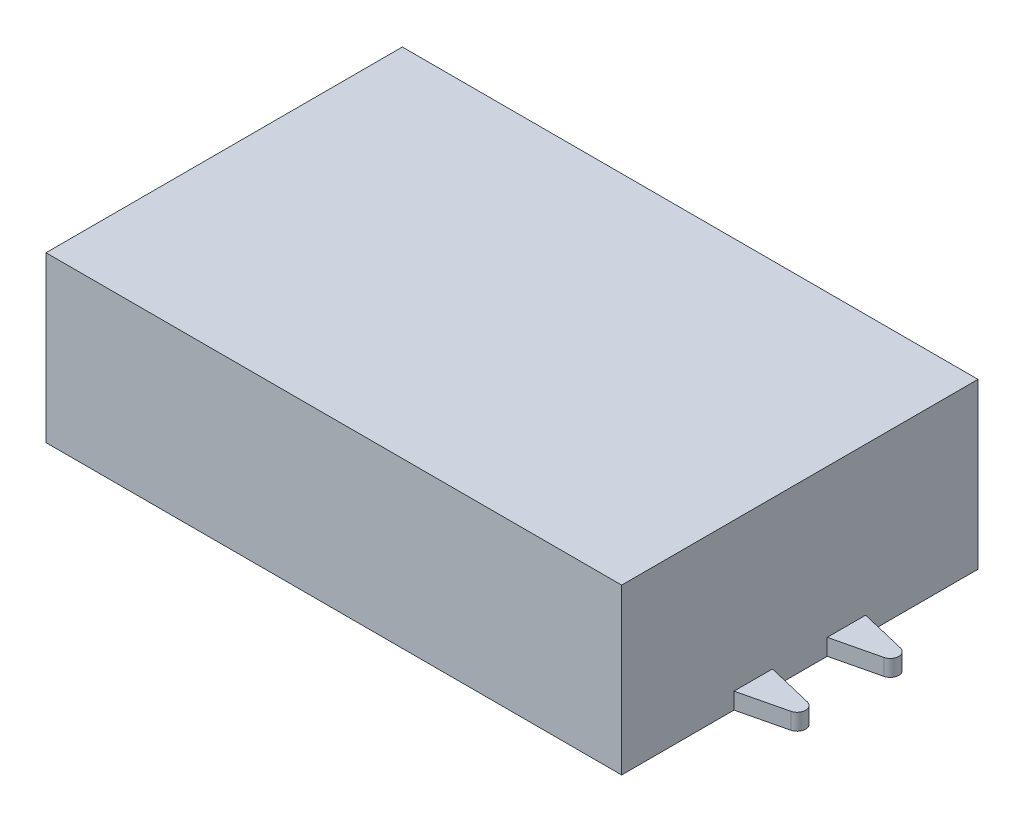
ISO-10303-21;
HEADER;
FILE_DESCRIPTION(('STEP AP214'),'2;1');
FILE_NAME('part.step','',(''),(''),'','','');
FILE_SCHEMA(('AUTOMOTIVE_DESIGN { 1 0 10303 214 1 1 1 1 }'));
ENDSEC;
DATA;
#1=APPLICATION_CONTEXT('core data for automotive mechanical design processes');
#2=APPLICATION_PROTOCOL_DEFINITION('international standard','automotive_design',2000,#1);
#3=PRODUCT_CONTEXT('',#1,'mechanical');
#4=PRODUCT('Part','Part','',(#3));
#5=PRODUCT_RELATED_PRODUCT_CATEGORY('part','',(#4));
#6=PRODUCT_DEFINITION_FORMATION('','',#4);
#7=PRODUCT_DEFINITION_CONTEXT('part definition',#1,'design');
#8=PRODUCT_DEFINITION('design','',#6,#7);
#9=PRODUCT_DEFINITION_SHAPE('','',#8);
#10=(LENGTH_UNIT() NAMED_UNIT(*) SI_UNIT(.MILLI.,.METRE.));
#11=(NAMED_UNIT(*) PLANE_ANGLE_UNIT() SI_UNIT($,.RADIAN.));
#12=(NAMED_UNIT(*) SI_UNIT($,.STERADIAN.) SOLID_ANGLE_UNIT());
#13=UNCERTAINTY_MEASURE_WITH_UNIT(LENGTH_MEASURE(1.E-05),#10,'distance_accuracy_value','');
#14=(GEOMETRIC_REPRESENTATION_CONTEXT(3) GLOBAL_UNCERTAINTY_ASSIGNED_CONTEXT((#13)) GLOBAL_UNIT_ASSIGNED_CONTEXT((#10,
#11,#12)) REPRESENTATION_CONTEXT('',''));
#15=CARTESIAN_POINT('',(0.,0.,0.));
#16=DIRECTION('',(0.,0.,1.));
#17=DIRECTION('',(1.,0.,0.));
#18=AXIS2_PLACEMENT_3D('',#15,#16,#17);
#19=CARTESIAN_POINT('',(-52.5,30.,32.5));
#20=DIRECTION('',(1.,0.,0.));
#21=DIRECTION('',(0.,0.,-1.));
#22=AXIS2_PLACEMENT_3D('',#19,#20,#21);
#23=PLANE('',#22);
#24=DIRECTION('',(0.,-1.,0.));
#25=VECTOR('',#24,1.);
#26=CARTESIAN_POINT('',(-52.5,3.,5.));
#27=LINE('',#26,#25);
#28=CARTESIAN_POINT('',(-52.5,3.,5.));
#29=VERTEX_POINT('',#28);
#30=CARTESIAN_POINT('',(-52.5,0.,5.));
#31=VERTEX_POINT('',#30);
#32=EDGE_CURVE('E53',#29,#31,#27,.T.);
#33=ORIENTED_EDGE('',*,*,#32,.F.);
#34=DIRECTION('',(0.,0.,-1.));
#35=VECTOR('',#34,1.);
#36=CARTESIAN_POINT('',(-52.5,3.,12.));
#37=LINE('',#36,#35);
#38=CARTESIAN_POINT('',(-52.5,3.,12.));
#39=VERTEX_POINT('',#38);
#40=EDGE_CURVE('E48',#39,#29,#37,.T.);
#41=ORIENTED_EDGE('',*,*,#40,.F.);
#42=DIRECTION('',(0.,-1.,0.));
#43=VECTOR('',#42,1.);
#44=CARTESIAN_POINT('',(-52.5,3.,12.));
#45=LINE('',#44,#43);
#46=CARTESIAN_POINT('',(-52.5,0.,12.));
#47=VERTEX_POINT('',#46);
#48=EDGE_CURVE('E189',#39,#47,#45,.T.);
#49=ORIENTED_EDGE('',*,*,#48,.T.);
#50=DIRECTION('',(0.,0.,1.));
#51=VECTOR('',#50,1.);
#52=CARTESIAN_POINT('',(-52.5,0.,32.5));
#53=LINE('',#52,#51);
#54=CARTESIAN_POINT('',(-52.5,0.,32.5));
#55=VERTEX_POINT('',#54);
#56=EDGE_CURVE('E311',#47,#55,#53,.T.);
#57=ORIENTED_EDGE('',*,*,#56,.T.);
#58=DIRECTION('',(0.,-1.,0.));
#59=VECTOR('',#58,1.);
#60=CARTESIAN_POINT('',(-52.5,30.,32.5));
#61=LINE('',#60,#59);
#62=CARTESIAN_POINT('',(-52.5,30.,32.5));
#63=VERTEX_POINT('',#62);
#64=EDGE_CURVE('E319',#63,#55,#61,.T.);
#65=ORIENTED_EDGE('',*,*,#64,.F.);
#66=DIRECTION('',(0.,0.,1.));
#67=VECTOR('',#66,1.);
#68=CARTESIAN_POINT('',(-52.5,30.,32.5));
#69=LINE('',#68,#67);
#70=CARTESIAN_POINT('',(-52.5,30.,-32.5));
#71=VERTEX_POINT('',#70);
#72=EDGE_CURVE('E300',#71,#63,#69,.T.);
#73=ORIENTED_EDGE('',*,*,#72,.F.);
#74=DIRECTION('',(0.,-1.,0.));
#75=VECTOR('',#74,1.);
#76=CARTESIAN_POINT('',(-52.5,30.,-32.5));
#77=LINE('',#76,#75);
#78=CARTESIAN_POINT('',(-52.5,0.,-32.5));
#79=VERTEX_POINT('',#78);
#80=EDGE_CURVE('E41',#71,#79,#77,.T.);
#81=ORIENTED_EDGE('',*,*,#80,.T.);
#82=CARTESIAN_POINT('',(-52.5,0.,-12.));
#83=VERTEX_POINT('',#82);
#84=EDGE_CURVE('E312',#79,#83,#53,.T.);
#85=ORIENTED_EDGE('',*,*,#84,.T.);
#86=DIRECTION('',(0.,-1.,0.));
#87=VECTOR('',#86,1.);
#88=CARTESIAN_POINT('',(-52.5,3.,-12.));
#89=LINE('',#88,#87);
#90=CARTESIAN_POINT('',(-52.5,3.,-12.));
#91=VERTEX_POINT('',#90);
#92=EDGE_CURVE('E226',#91,#83,#89,.T.);
#93=ORIENTED_EDGE('',*,*,#92,.F.);
#94=DIRECTION('',(0.,0.,1.));
#95=VECTOR('',#94,1.);
#96=CARTESIAN_POINT('',(-52.5,3.,-12.));
#97=LINE('',#96,#95);
#98=CARTESIAN_POINT('',(-52.5,3.,-5.));
#99=VERTEX_POINT('',#98);
#100=EDGE_CURVE('E205',#91,#99,#97,.T.);
#101=ORIENTED_EDGE('',*,*,#100,.T.);
#102=DIRECTION('',(0.,-1.,0.));
#103=VECTOR('',#102,1.);
#104=CARTESIAN_POINT('',(-52.5,3.,-5.));
#105=LINE('',#104,#103);
#106=CARTESIAN_POINT('',(-52.5,0.,-5.));
#107=VERTEX_POINT('',#106);
#108=EDGE_CURVE('E218',#99,#107,#105,.T.);
#109=ORIENTED_EDGE('',*,*,#108,.T.);
#110=EDGE_CURVE('E315',#107,#31,#53,.T.);
#111=ORIENTED_EDGE('',*,*,#110,.T.);
#112=EDGE_LOOP('',(#33,#41,#49,#57,#65,#73,#81,#85,#93,#101,#109,#111));
#113=FACE_BOUND('',#112,.T.);
#114=ADVANCED_FACE('F33',(#113),#23,.F.);
#115=CARTESIAN_POINT('',(52.5,30.,32.5));
#116=DIRECTION('',(-1.,0.,0.));
#117=DIRECTION('',(0.,0.,1.));
#118=AXIS2_PLACEMENT_3D('',#115,#116,#117);
#119=PLANE('',#118);
#120=DIRECTION('',(0.,-1.,0.));
#121=VECTOR('',#120,1.);
#122=CARTESIAN_POINT('',(52.5,3.,-5.));
#123=LINE('',#122,#121);
#124=CARTESIAN_POINT('',(52.5,3.,-5.));
#125=VERTEX_POINT('',#124);
#126=CARTESIAN_POINT('',(52.5,0.,-5.));
#127=VERTEX_POINT('',#126);
#128=EDGE_CURVE('E252',#125,#127,#123,.T.);
#129=ORIENTED_EDGE('',*,*,#128,.F.);
#130=DIRECTION('',(0.,0.,1.));
#131=VECTOR('',#130,1.);
#132=CARTESIAN_POINT('',(52.5,3.,-12.));
#133=LINE('',#132,#131);
#134=CARTESIAN_POINT('',(52.5,3.,-12.));
#135=VERTEX_POINT('',#134);
#136=EDGE_CURVE('E235',#135,#125,#133,.T.);
#137=ORIENTED_EDGE('',*,*,#136,.F.);
#138=DIRECTION('',(0.,-1.,0.));
#139=VECTOR('',#138,1.);
#140=CARTESIAN_POINT('',(52.5,3.,-12.));
#141=LINE('',#140,#139);
#142=CARTESIAN_POINT('',(52.5,0.,-12.));
#143=VERTEX_POINT('',#142);
#144=EDGE_CURVE('E246',#135,#143,#141,.T.);
#145=ORIENTED_EDGE('',*,*,#144,.T.);
#146=DIRECTION('',(0.,0.,-1.));
#147=VECTOR('',#146,1.);
#148=CARTESIAN_POINT('',(52.5,0.,32.5));
#149=LINE('',#148,#147);
#150=CARTESIAN_POINT('',(52.5,0.,-32.5));
#151=VERTEX_POINT('',#150);
#152=EDGE_CURVE('E287',#143,#151,#149,.T.);
#153=ORIENTED_EDGE('',*,*,#152,.T.);
#154=DIRECTION('',(0.,-1.,0.));
#155=VECTOR('',#154,1.);
#156=CARTESIAN_POINT('',(52.5,30.,-32.5));
#157=LINE('',#156,#155);
#158=CARTESIAN_POINT('',(52.5,30.,-32.5));
#159=VERTEX_POINT('',#158);
#160=EDGE_CURVE('E11',#159,#151,#157,.T.);
#161=ORIENTED_EDGE('',*,*,#160,.F.);
#162=DIRECTION('',(0.,0.,-1.));
#163=VECTOR('',#162,1.);
#164=CARTESIAN_POINT('',(52.5,30.,32.5));
#165=LINE('',#164,#163);
#166=CARTESIAN_POINT('',(52.5,30.,32.5));
#167=VERTEX_POINT('',#166);
#168=EDGE_CURVE('E294',#167,#159,#165,.T.);
#169=ORIENTED_EDGE('',*,*,#168,.F.);
#170=DIRECTION('',(0.,-1.,0.));
#171=VECTOR('',#170,1.);
#172=CARTESIAN_POINT('',(52.5,30.,32.5));
#173=LINE('',#172,#171);
#174=CARTESIAN_POINT('',(52.5,0.,32.5));
#175=VERTEX_POINT('',#174);
#176=EDGE_CURVE('E304',#167,#175,#173,.T.);
#177=ORIENTED_EDGE('',*,*,#176,.T.);
#178=CARTESIAN_POINT('',(52.5,0.,12.));
#179=VERTEX_POINT('',#178);
#180=EDGE_CURVE('E305',#175,#179,#149,.T.);
#181=ORIENTED_EDGE('',*,*,#180,.T.);
#182=DIRECTION('',(0.,-1.,0.));
#183=VECTOR('',#182,1.);
#184=CARTESIAN_POINT('',(52.5,3.,12.));
#185=LINE('',#184,#183);
#186=CARTESIAN_POINT('',(52.5,3.,12.));
#187=VERTEX_POINT('',#186);
#188=EDGE_CURVE('E285',#187,#179,#185,.T.);
#189=ORIENTED_EDGE('',*,*,#188,.F.);
#190=DIRECTION('',(0.,0.,-1.));
#191=VECTOR('',#190,1.);
#192=CARTESIAN_POINT('',(52.5,3.,12.));
#193=LINE('',#192,#191);
#194=CARTESIAN_POINT('',(52.5,3.,5.));
#195=VERTEX_POINT('',#194);
#196=EDGE_CURVE('E264',#187,#195,#193,.T.);
#197=ORIENTED_EDGE('',*,*,#196,.T.);
#198=DIRECTION('',(0.,-1.,0.));
#199=VECTOR('',#198,1.);
#200=CARTESIAN_POINT('',(52.5,3.,5.));
#201=LINE('',#200,#199);
#202=CARTESIAN_POINT('',(52.5,0.,5.));
#203=VERTEX_POINT('',#202);
#204=EDGE_CURVE('E277',#195,#203,#201,.T.);
#205=ORIENTED_EDGE('',*,*,#204,.T.);
#206=EDGE_CURVE('E309',#203,#127,#149,.T.);
#207=ORIENTED_EDGE('',*,*,#206,.T.);
#208=EDGE_LOOP('',(#129,#137,#145,#153,#161,#169,#177,#181,#189,#197,#205,#207));
#209=FACE_BOUND('',#208,.T.);
#210=ADVANCED_FACE('F35',(#209),#119,.F.);
#211=CARTESIAN_POINT('',(-52.5,30.,-32.5));
#212=DIRECTION('',(0.,0.,1.));
#213=DIRECTION('',(1.,0.,0.));
#214=AXIS2_PLACEMENT_3D('',#211,#212,#213);
#215=PLANE('',#214);
#216=DIRECTION('',(-1.,0.,0.));
#217=VECTOR('',#216,1.);
#218=CARTESIAN_POINT('',(-52.5,0.,-32.5));
#219=LINE('',#218,#217);
#220=EDGE_CURVE('E308',#151,#79,#219,.T.);
#221=ORIENTED_EDGE('',*,*,#220,.T.);
#222=ORIENTED_EDGE('',*,*,#80,.F.);
#223=DIRECTION('',(-1.,0.,0.));
#224=VECTOR('',#223,1.);
#225=CARTESIAN_POINT('',(-52.5,30.,-32.5));
#226=LINE('',#225,#224);
#227=EDGE_CURVE('E297',#159,#71,#226,.T.);
#228=ORIENTED_EDGE('',*,*,#227,.F.);
#229=ORIENTED_EDGE('',*,*,#160,.T.);
#230=EDGE_LOOP('',(#221,#222,#228,#229));
#231=FACE_BOUND('',#230,.T.);
#232=ADVANCED_FACE('F357',(#231),#215,.F.);
#233=CARTESIAN_POINT('',(-52.5,30.,32.5));
#234=DIRECTION('',(0.,0.,-1.));
#235=DIRECTION('',(-1.,0.,0.));
#236=AXIS2_PLACEMENT_3D('',#233,#234,#235);
#237=PLANE('',#236);
#238=DIRECTION('',(1.,0.,0.));
#239=VECTOR('',#238,1.);
#240=CARTESIAN_POINT('',(-52.5,0.,32.5));
#241=LINE('',#240,#239);
#242=EDGE_CURVE('E298',#55,#175,#241,.T.);
#243=ORIENTED_EDGE('',*,*,#242,.T.);
#244=ORIENTED_EDGE('',*,*,#176,.F.);
#245=DIRECTION('',(1.,0.,0.));
#246=VECTOR('',#245,1.);
#247=CARTESIAN_POINT('',(-52.5,30.,32.5));
#248=LINE('',#247,#246);
#249=EDGE_CURVE('E302',#63,#167,#248,.T.);
#250=ORIENTED_EDGE('',*,*,#249,.F.);
#251=ORIENTED_EDGE('',*,*,#64,.T.);
#252=EDGE_LOOP('',(#243,#244,#250,#251));
#253=FACE_BOUND('',#252,.T.);
#254=ADVANCED_FACE('F348',(#253),#237,.F.);
#255=CARTESIAN_POINT('',(0.,30.,0.));
#256=DIRECTION('',(0.,-1.,0.));
#257=DIRECTION('',(0.,0.,-1.));
#258=AXIS2_PLACEMENT_3D('',#255,#256,#257);
#259=PLANE('',#258);
#260=ORIENTED_EDGE('',*,*,#168,.T.);
#261=ORIENTED_EDGE('',*,*,#227,.T.);
#262=ORIENTED_EDGE('',*,*,#72,.T.);
#263=ORIENTED_EDGE('',*,*,#249,.T.);
#264=EDGE_LOOP('',(#260,#261,#262,#263));
#265=FACE_BOUND('',#264,.T.);
#266=ADVANCED_FACE('F356',(#265),#259,.F.);
#267=CARTESIAN_POINT('',(0.,0.,0.));
#268=DIRECTION('',(0.,-1.,0.));
#269=DIRECTION('',(0.,0.,-1.));
#270=AXIS2_PLACEMENT_3D('',#267,#268,#269);
#271=PLANE('',#270);
#272=ORIENTED_EDGE('',*,*,#180,.F.);
#273=ORIENTED_EDGE('',*,*,#242,.F.);
#274=ORIENTED_EDGE('',*,*,#56,.F.);
#275=DIRECTION('',(0.972549069423777,0.,0.232697889038439));
#276=VECTOR('',#275,1.);
#277=CARTESIAN_POINT('',(-52.5,0.,12.));
#278=LINE('',#277,#276);
#279=CARTESIAN_POINT('',(-60.8588989435407,0.,10.));
#280=VERTEX_POINT('',#279);
#281=EDGE_CURVE('E197',#280,#47,#278,.T.);
#282=ORIENTED_EDGE('',*,*,#281,.F.);
#283=CARTESIAN_POINT('',(-60.5,0.,8.5));
#284=DIRECTION('',(0.,1.,0.));
#285=DIRECTION('',(0.,0.,1.));
#286=AXIS2_PLACEMENT_3D('',#283,#284,#285);
#287=CIRCLE('',#286,1.54233863067571);
#288=CARTESIAN_POINT('',(-60.8588989435407,0.,7.));
#289=VERTEX_POINT('',#288);
#290=EDGE_CURVE('E184',#289,#280,#287,.T.);
#291=ORIENTED_EDGE('',*,*,#290,.F.);
#292=DIRECTION('',(-0.972549069423777,0.,0.232697889038439));
#293=VECTOR('',#292,1.);
#294=CARTESIAN_POINT('',(-60.8588989435407,0.,7.));
#295=LINE('',#294,#293);
#296=EDGE_CURVE('E193',#31,#289,#295,.T.);
#297=ORIENTED_EDGE('',*,*,#296,.F.);
#298=ORIENTED_EDGE('',*,*,#110,.F.);
#299=DIRECTION('',(-0.972549069423777,0.,-0.232697889038439));
#300=VECTOR('',#299,1.);
#301=CARTESIAN_POINT('',(-60.8588989435407,0.,-7.));
#302=LINE('',#301,#300);
#303=CARTESIAN_POINT('',(-60.8588989435407,0.,-7.));
#304=VERTEX_POINT('',#303);
#305=EDGE_CURVE('E202',#107,#304,#302,.T.);
#306=ORIENTED_EDGE('',*,*,#305,.T.);
#307=CARTESIAN_POINT('',(-60.5,0.,-8.5));
#308=DIRECTION('',(0.,-1.,0.));
#309=DIRECTION('',(0.,0.,-1.));
#310=AXIS2_PLACEMENT_3D('',#307,#308,#309);
#311=CIRCLE('',#310,1.54233863067571);
#312=CARTESIAN_POINT('',(-60.8588989435407,0.,-10.));
#313=VERTEX_POINT('',#312);
#314=EDGE_CURVE('E221',#304,#313,#311,.T.);
#315=ORIENTED_EDGE('',*,*,#314,.T.);
#316=DIRECTION('',(0.972549069423777,0.,-0.232697889038439));
#317=VECTOR('',#316,1.);
#318=CARTESIAN_POINT('',(-52.5,0.,-12.));
#319=LINE('',#318,#317);
#320=EDGE_CURVE('E209',#313,#83,#319,.T.);
#321=ORIENTED_EDGE('',*,*,#320,.T.);
#322=ORIENTED_EDGE('',*,*,#84,.F.);
#323=ORIENTED_EDGE('',*,*,#220,.F.);
#324=ORIENTED_EDGE('',*,*,#152,.F.);
#325=DIRECTION('',(-0.972549069423777,0.,-0.232697889038439));
#326=VECTOR('',#325,1.);
#327=CARTESIAN_POINT('',(52.5,0.,-12.));
#328=LINE('',#327,#326);
#329=CARTESIAN_POINT('',(60.8588989435407,0.,-10.));
#330=VERTEX_POINT('',#329);
#331=EDGE_CURVE('E228',#330,#143,#328,.T.);
#332=ORIENTED_EDGE('',*,*,#331,.F.);
#333=CARTESIAN_POINT('',(60.5,0.,-8.5));
#334=DIRECTION('',(0.,1.,0.));
#335=DIRECTION('',(0.,0.,-1.));
#336=AXIS2_PLACEMENT_3D('',#333,#334,#335);
#337=CIRCLE('',#336,1.54233863067571);
#338=CARTESIAN_POINT('',(60.8588989435407,0.,-7.));
#339=VERTEX_POINT('',#338);
#340=EDGE_CURVE('E249',#339,#330,#337,.T.);
#341=ORIENTED_EDGE('',*,*,#340,.F.);
#342=DIRECTION('',(0.972549069423777,0.,-0.232697889038439));
#343=VECTOR('',#342,1.);
#344=CARTESIAN_POINT('',(60.8588989435407,0.,-7.));
#345=LINE('',#344,#343);
#346=EDGE_CURVE('E239',#127,#339,#345,.T.);
#347=ORIENTED_EDGE('',*,*,#346,.F.);
#348=ORIENTED_EDGE('',*,*,#206,.F.);
#349=DIRECTION('',(0.972549069423777,0.,0.232697889038439));
#350=VECTOR('',#349,1.);
#351=CARTESIAN_POINT('',(60.8588989435407,0.,7.));
#352=LINE('',#351,#350);
#353=CARTESIAN_POINT('',(60.8588989435407,0.,7.));
#354=VERTEX_POINT('',#353);
#355=EDGE_CURVE('E255',#203,#354,#352,.T.);
#356=ORIENTED_EDGE('',*,*,#355,.T.);
#357=CARTESIAN_POINT('',(60.5,0.,8.5));
#358=DIRECTION('',(0.,-1.,0.));
#359=DIRECTION('',(0.,0.,1.));
#360=AXIS2_PLACEMENT_3D('',#357,#358,#359);
#361=CIRCLE('',#360,1.54233863067571);
#362=CARTESIAN_POINT('',(60.8588989435407,0.,10.));
#363=VERTEX_POINT('',#362);
#364=EDGE_CURVE('E280',#354,#363,#361,.T.);
#365=ORIENTED_EDGE('',*,*,#364,.T.);
#366=DIRECTION('',(-0.972549069423777,0.,0.232697889038439));
#367=VECTOR('',#366,1.);
#368=CARTESIAN_POINT('',(52.5,0.,12.));
#369=LINE('',#368,#367);
#370=EDGE_CURVE('E268',#363,#179,#369,.T.);
#371=ORIENTED_EDGE('',*,*,#370,.T.);
#372=EDGE_LOOP('',(#272,#273,#274,#282,#291,#297,#298,#306,#315,#321,#322,#323,#324,#332,#341,
#347,#348,#356,#365,#371));
#373=FACE_BOUND('',#372,.T.);
#374=ADVANCED_FACE('F331',(#373),#271,.T.);
#375=CARTESIAN_POINT('',(52.5,3.,12.));
#376=DIRECTION('',(0.232697889038439,0.,0.972549069423777));
#377=DIRECTION('',(0.972549069423777,0.,-0.232697889038439));
#378=AXIS2_PLACEMENT_3D('',#375,#376,#377);
#379=PLANE('',#378);
#380=ORIENTED_EDGE('',*,*,#370,.F.);
#381=DIRECTION('',(0.,-1.,0.));
#382=VECTOR('',#381,1.);
#383=CARTESIAN_POINT('',(60.8588989435407,3.,10.));
#384=LINE('',#383,#382);
#385=CARTESIAN_POINT('',(60.8588989435407,3.,10.));
#386=VERTEX_POINT('',#385);
#387=EDGE_CURVE('E288',#386,#363,#384,.T.);
#388=ORIENTED_EDGE('',*,*,#387,.F.);
#389=DIRECTION('',(-0.972549069423777,0.,0.232697889038439));
#390=VECTOR('',#389,1.);
#391=CARTESIAN_POINT('',(52.5,3.,12.));
#392=LINE('',#391,#390);
#393=EDGE_CURVE('E274',#386,#187,#392,.T.);
#394=ORIENTED_EDGE('',*,*,#393,.T.);
#395=ORIENTED_EDGE('',*,*,#188,.T.);
#396=EDGE_LOOP('',(#380,#388,#394,#395));
#397=FACE_BOUND('',#396,.T.);
#398=ADVANCED_FACE('F371',(#397),#379,.T.);
#399=CARTESIAN_POINT('',(60.5,3.,8.5));
#400=DIRECTION('',(0.,-1.,0.));
#401=DIRECTION('',(0.,0.,-1.));
#402=AXIS2_PLACEMENT_3D('',#399,#400,#401);
#403=CYLINDRICAL_SURFACE('',#402,1.54233863067571);
#404=ORIENTED_EDGE('',*,*,#364,.F.);
#405=DIRECTION('',(0.,-1.,0.));
#406=VECTOR('',#405,1.);
#407=CARTESIAN_POINT('',(60.8588989435407,3.,7.));
#408=LINE('',#407,#406);
#409=CARTESIAN_POINT('',(60.8588989435407,3.,7.));
#410=VERTEX_POINT('',#409);
#411=EDGE_CURVE('E290',#410,#354,#408,.T.);
#412=ORIENTED_EDGE('',*,*,#411,.F.);
#413=CARTESIAN_POINT('',(60.5,3.,8.5));
#414=DIRECTION('',(0.,-1.,0.));
#415=DIRECTION('',(0.,0.,1.));
#416=AXIS2_PLACEMENT_3D('',#413,#414,#415);
#417=CIRCLE('',#416,1.54233863067571);
#418=EDGE_CURVE('E271',#410,#386,#417,.T.);
#419=ORIENTED_EDGE('',*,*,#418,.T.);
#420=ORIENTED_EDGE('',*,*,#387,.T.);
#421=EDGE_LOOP('',(#404,#412,#419,#420));
#422=FACE_BOUND('',#421,.T.);
#423=ADVANCED_FACE('F378',(#422),#403,.T.);
#424=CARTESIAN_POINT('',(60.8588989435407,3.,7.));
#425=DIRECTION('',(0.232697889038439,0.,-0.972549069423777));
#426=DIRECTION('',(-0.972549069423777,0.,-0.232697889038439));
#427=AXIS2_PLACEMENT_3D('',#424,#425,#426);
#428=PLANE('',#427);
#429=ORIENTED_EDGE('',*,*,#355,.F.);
#430=ORIENTED_EDGE('',*,*,#204,.F.);
#431=DIRECTION('',(0.972549069423777,0.,0.232697889038439));
#432=VECTOR('',#431,1.);
#433=CARTESIAN_POINT('',(60.8588989435407,3.,7.));
#434=LINE('',#433,#432);
#435=EDGE_CURVE('E267',#195,#410,#434,.T.);
#436=ORIENTED_EDGE('',*,*,#435,.T.);
#437=ORIENTED_EDGE('',*,*,#411,.T.);
#438=EDGE_LOOP('',(#429,#430,#436,#437));
#439=FACE_BOUND('',#438,.T.);
#440=ADVANCED_FACE('F374',(#439),#428,.T.);
#441=CARTESIAN_POINT('',(60.5,3.,8.5));
#442=DIRECTION('',(0.,1.,0.));
#443=DIRECTION('',(0.,0.,1.));
#444=AXIS2_PLACEMENT_3D('',#441,#442,#443);
#445=PLANE('',#444);
#446=ORIENTED_EDGE('',*,*,#196,.F.);
#447=ORIENTED_EDGE('',*,*,#393,.F.);
#448=ORIENTED_EDGE('',*,*,#418,.F.);
#449=ORIENTED_EDGE('',*,*,#435,.F.);
#450=EDGE_LOOP('',(#446,#447,#448,#449));
#451=FACE_BOUND('',#450,.T.);
#452=ADVANCED_FACE('F377',(#451),#445,.T.);
#453=CARTESIAN_POINT('',(60.8588989435407,3.,-7.));
#454=DIRECTION('',(-0.232697889038439,0.,-0.972549069423777));
#455=DIRECTION('',(-0.972549069423777,0.,0.232697889038439));
#456=AXIS2_PLACEMENT_3D('',#453,#454,#455);
#457=PLANE('',#456);
#458=ORIENTED_EDGE('',*,*,#346,.T.);
#459=DIRECTION('',(0.,-1.,0.));
#460=VECTOR('',#459,1.);
#461=CARTESIAN_POINT('',(60.8588989435407,3.,-7.));
#462=LINE('',#461,#460);
#463=CARTESIAN_POINT('',(60.8588989435407,3.,-7.));
#464=VERTEX_POINT('',#463);
#465=EDGE_CURVE('E256',#464,#339,#462,.T.);
#466=ORIENTED_EDGE('',*,*,#465,.F.);
#467=DIRECTION('',(0.972549069423777,0.,-0.232697889038439));
#468=VECTOR('',#467,1.);
#469=CARTESIAN_POINT('',(60.8588989435407,3.,-7.));
#470=LINE('',#469,#468);
#471=EDGE_CURVE('E244',#125,#464,#470,.T.);
#472=ORIENTED_EDGE('',*,*,#471,.F.);
#473=ORIENTED_EDGE('',*,*,#128,.T.);
#474=EDGE_LOOP('',(#458,#466,#472,#473));
#475=FACE_BOUND('',#474,.T.);
#476=ADVANCED_FACE('F388',(#475),#457,.F.);
#477=CARTESIAN_POINT('',(60.5,3.,-8.5));
#478=DIRECTION('',(0.,-1.,0.));
#479=DIRECTION('',(0.,0.,-1.));
#480=AXIS2_PLACEMENT_3D('',#477,#478,#479);
#481=CYLINDRICAL_SURFACE('',#480,1.54233863067571);
#482=ORIENTED_EDGE('',*,*,#340,.T.);
#483=DIRECTION('',(0.,-1.,0.));
#484=VECTOR('',#483,1.);
#485=CARTESIAN_POINT('',(60.8588989435407,3.,-10.));
#486=LINE('',#485,#484);
#487=CARTESIAN_POINT('',(60.8588989435407,3.,-10.));
#488=VERTEX_POINT('',#487);
#489=EDGE_CURVE('E259',#488,#330,#486,.T.);
#490=ORIENTED_EDGE('',*,*,#489,.F.);
#491=CARTESIAN_POINT('',(60.5,3.,-8.5));
#492=DIRECTION('',(0.,1.,0.));
#493=DIRECTION('',(0.,0.,-1.));
#494=AXIS2_PLACEMENT_3D('',#491,#492,#493);
#495=CIRCLE('',#494,1.54233863067571);
#496=EDGE_CURVE('E242',#464,#488,#495,.T.);
#497=ORIENTED_EDGE('',*,*,#496,.F.);
#498=ORIENTED_EDGE('',*,*,#465,.T.);
#499=EDGE_LOOP('',(#482,#490,#497,#498));
#500=FACE_BOUND('',#499,.T.);
#501=ADVANCED_FACE('F394',(#500),#481,.T.);
#502=CARTESIAN_POINT('',(52.5,3.,-12.));
#503=DIRECTION('',(-0.232697889038439,0.,0.972549069423777));
#504=DIRECTION('',(0.972549069423777,0.,0.232697889038439));
#505=AXIS2_PLACEMENT_3D('',#502,#503,#504);
#506=PLANE('',#505);
#507=ORIENTED_EDGE('',*,*,#331,.T.);
#508=ORIENTED_EDGE('',*,*,#144,.F.);
#509=DIRECTION('',(-0.972549069423777,0.,-0.232697889038439));
#510=VECTOR('',#509,1.);
#511=CARTESIAN_POINT('',(52.5,3.,-12.));
#512=LINE('',#511,#510);
#513=EDGE_CURVE('E238',#488,#135,#512,.T.);
#514=ORIENTED_EDGE('',*,*,#513,.F.);
#515=ORIENTED_EDGE('',*,*,#489,.T.);
#516=EDGE_LOOP('',(#507,#508,#514,#515));
#517=FACE_BOUND('',#516,.T.);
#518=ADVANCED_FACE('F390',(#517),#506,.F.);
#519=CARTESIAN_POINT('',(60.5,3.,-8.5));
#520=DIRECTION('',(0.,1.,0.));
#521=DIRECTION('',(0.,0.,-1.));
#522=AXIS2_PLACEMENT_3D('',#519,#520,#521);
#523=PLANE('',#522);
#524=ORIENTED_EDGE('',*,*,#136,.T.);
#525=ORIENTED_EDGE('',*,*,#471,.T.);
#526=ORIENTED_EDGE('',*,*,#496,.T.);
#527=ORIENTED_EDGE('',*,*,#513,.T.);
#528=EDGE_LOOP('',(#524,#525,#526,#527));
#529=FACE_BOUND('',#528,.T.);
#530=ADVANCED_FACE('F393',(#529),#523,.T.);
#531=CARTESIAN_POINT('',(-52.5,3.,-12.));
#532=DIRECTION('',(-0.232697889038439,0.,-0.972549069423777));
#533=DIRECTION('',(-0.972549069423777,0.,0.232697889038439));
#534=AXIS2_PLACEMENT_3D('',#531,#532,#533);
#535=PLANE('',#534);
#536=ORIENTED_EDGE('',*,*,#320,.F.);
#537=DIRECTION('',(0.,-1.,0.));
#538=VECTOR('',#537,1.);
#539=CARTESIAN_POINT('',(-60.8588989435407,3.,-10.));
#540=LINE('',#539,#538);
#541=CARTESIAN_POINT('',(-60.8588989435407,3.,-10.));
#542=VERTEX_POINT('',#541);
#543=EDGE_CURVE('E229',#542,#313,#540,.T.);
#544=ORIENTED_EDGE('',*,*,#543,.F.);
#545=DIRECTION('',(0.972549069423777,0.,-0.232697889038439));
#546=VECTOR('',#545,1.);
#547=CARTESIAN_POINT('',(-52.5,3.,-12.));
#548=LINE('',#547,#546);
#549=EDGE_CURVE('E215',#542,#91,#548,.T.);
#550=ORIENTED_EDGE('',*,*,#549,.T.);
#551=ORIENTED_EDGE('',*,*,#92,.T.);
#552=EDGE_LOOP('',(#536,#544,#550,#551));
#553=FACE_BOUND('',#552,.T.);
#554=ADVANCED_FACE('F335',(#553),#535,.T.);
#555=CARTESIAN_POINT('',(-60.5,3.,-8.5));
#556=DIRECTION('',(0.,-1.,0.));
#557=DIRECTION('',(0.,0.,-1.));
#558=AXIS2_PLACEMENT_3D('',#555,#556,#557);
#559=CYLINDRICAL_SURFACE('',#558,1.54233863067571);
#560=ORIENTED_EDGE('',*,*,#314,.F.);
#561=DIRECTION('',(0.,-1.,0.));
#562=VECTOR('',#561,1.);
#563=CARTESIAN_POINT('',(-60.8588989435407,3.,-7.));
#564=LINE('',#563,#562);
#565=CARTESIAN_POINT('',(-60.8588989435407,3.,-7.));
#566=VERTEX_POINT('',#565);
#567=EDGE_CURVE('E231',#566,#304,#564,.T.);
#568=ORIENTED_EDGE('',*,*,#567,.F.);
#569=CARTESIAN_POINT('',(-60.5,3.,-8.5));
#570=DIRECTION('',(0.,-1.,0.));
#571=DIRECTION('',(0.,0.,-1.));
#572=AXIS2_PLACEMENT_3D('',#569,#570,#571);
#573=CIRCLE('',#572,1.54233863067571);
#574=EDGE_CURVE('E212',#566,#542,#573,.T.);
#575=ORIENTED_EDGE('',*,*,#574,.T.);
#576=ORIENTED_EDGE('',*,*,#543,.T.);
#577=EDGE_LOOP('',(#560,#568,#575,#576));
#578=FACE_BOUND('',#577,.T.);
#579=ADVANCED_FACE('F407',(#578),#559,.T.);
#580=CARTESIAN_POINT('',(-60.8588989435407,3.,-7.));
#581=DIRECTION('',(-0.232697889038439,0.,0.972549069423777));
#582=DIRECTION('',(0.972549069423777,0.,0.232697889038439));
#583=AXIS2_PLACEMENT_3D('',#580,#581,#582);
#584=PLANE('',#583);
#585=ORIENTED_EDGE('',*,*,#305,.F.);
#586=ORIENTED_EDGE('',*,*,#108,.F.);
#587=DIRECTION('',(-0.972549069423777,0.,-0.232697889038439));
#588=VECTOR('',#587,1.);
#589=CARTESIAN_POINT('',(-60.8588989435407,3.,-7.));
#590=LINE('',#589,#588);
#591=EDGE_CURVE('E208',#99,#566,#590,.T.);
#592=ORIENTED_EDGE('',*,*,#591,.T.);
#593=ORIENTED_EDGE('',*,*,#567,.T.);
#594=EDGE_LOOP('',(#585,#586,#592,#593));
#595=FACE_BOUND('',#594,.T.);
#596=ADVANCED_FACE('F343',(#595),#584,.T.);
#597=CARTESIAN_POINT('',(-60.5,3.,-8.5));
#598=DIRECTION('',(0.,1.,0.));
#599=DIRECTION('',(0.,0.,-1.));
#600=AXIS2_PLACEMENT_3D('',#597,#598,#599);
#601=PLANE('',#600);
#602=ORIENTED_EDGE('',*,*,#100,.F.);
#603=ORIENTED_EDGE('',*,*,#549,.F.);
#604=ORIENTED_EDGE('',*,*,#574,.F.);
#605=ORIENTED_EDGE('',*,*,#591,.F.);
#606=EDGE_LOOP('',(#602,#603,#604,#605));
#607=FACE_BOUND('',#606,.T.);
#608=ADVANCED_FACE('F340',(#607),#601,.T.);
#609=CARTESIAN_POINT('',(-60.8588989435407,3.,7.));
#610=DIRECTION('',(0.232697889038439,0.,0.972549069423777));
#611=DIRECTION('',(0.972549069423777,0.,-0.232697889038439));
#612=AXIS2_PLACEMENT_3D('',#609,#610,#611);
#613=PLANE('',#612);
#614=ORIENTED_EDGE('',*,*,#296,.T.);
#615=DIRECTION('',(0.,-1.,0.));
#616=VECTOR('',#615,1.);
#617=CARTESIAN_POINT('',(-60.8588989435407,3.,7.));
#618=LINE('',#617,#616);
#619=CARTESIAN_POINT('',(-60.8588989435407,3.,7.));
#620=VERTEX_POINT('',#619);
#621=EDGE_CURVE('E188',#620,#289,#618,.T.);
#622=ORIENTED_EDGE('',*,*,#621,.F.);
#623=DIRECTION('',(-0.972549069423777,0.,0.232697889038439));
#624=VECTOR('',#623,1.);
#625=CARTESIAN_POINT('',(-60.8588989435407,3.,7.));
#626=LINE('',#625,#624);
#627=EDGE_CURVE('E175',#29,#620,#626,.T.);
#628=ORIENTED_EDGE('',*,*,#627,.F.);
#629=ORIENTED_EDGE('',*,*,#32,.T.);
#630=EDGE_LOOP('',(#614,#622,#628,#629));
#631=FACE_BOUND('',#630,.T.);
#632=ADVANCED_FACE('F415',(#631),#613,.F.);
#633=CARTESIAN_POINT('',(-60.5,3.,8.5));
#634=DIRECTION('',(0.,-1.,0.));
#635=DIRECTION('',(0.,0.,-1.));
#636=AXIS2_PLACEMENT_3D('',#633,#634,#635);
#637=CYLINDRICAL_SURFACE('',#636,1.54233863067571);
#638=ORIENTED_EDGE('',*,*,#290,.T.);
#639=DIRECTION('',(0.,-1.,0.));
#640=VECTOR('',#639,1.);
#641=CARTESIAN_POINT('',(-60.8588989435407,3.,10.));
#642=LINE('',#641,#640);
#643=CARTESIAN_POINT('',(-60.8588989435407,3.,10.));
#644=VERTEX_POINT('',#643);
#645=EDGE_CURVE('E181',#644,#280,#642,.T.);
#646=ORIENTED_EDGE('',*,*,#645,.F.);
#647=CARTESIAN_POINT('',(-60.5,3.,8.5));
#648=DIRECTION('',(0.,1.,0.));
#649=DIRECTION('',(0.,0.,1.));
#650=AXIS2_PLACEMENT_3D('',#647,#648,#649);
#651=CIRCLE('',#650,1.54233863067571);
#652=EDGE_CURVE('E169',#620,#644,#651,.T.);
#653=ORIENTED_EDGE('',*,*,#652,.F.);
#654=ORIENTED_EDGE('',*,*,#621,.T.);
#655=EDGE_LOOP('',(#638,#646,#653,#654));
#656=FACE_BOUND('',#655,.T.);
#657=ADVANCED_FACE('F182',(#656),#637,.T.);
#658=CARTESIAN_POINT('',(-52.5,3.,12.));
#659=DIRECTION('',(0.232697889038439,0.,-0.972549069423777));
#660=DIRECTION('',(-0.972549069423777,0.,-0.232697889038439));
#661=AXIS2_PLACEMENT_3D('',#658,#659,#660);
#662=PLANE('',#661);
#663=ORIENTED_EDGE('',*,*,#281,.T.);
#664=ORIENTED_EDGE('',*,*,#48,.F.);
#665=DIRECTION('',(0.972549069423777,0.,0.232697889038439));
#666=VECTOR('',#665,1.);
#667=CARTESIAN_POINT('',(-52.5,3.,12.));
#668=LINE('',#667,#666);
#669=EDGE_CURVE('E173',#644,#39,#668,.T.);
#670=ORIENTED_EDGE('',*,*,#669,.F.);
#671=ORIENTED_EDGE('',*,*,#645,.T.);
#672=EDGE_LOOP('',(#663,#664,#670,#671));
#673=FACE_BOUND('',#672,.T.);
#674=ADVANCED_FACE('F191',(#673),#662,.F.);
#675=CARTESIAN_POINT('',(-60.5,3.,8.5));
#676=DIRECTION('',(0.,1.,0.));
#677=DIRECTION('',(0.,0.,1.));
#678=AXIS2_PLACEMENT_3D('',#675,#676,#677);
#679=PLANE('',#678);
#680=ORIENTED_EDGE('',*,*,#40,.T.);
#681=ORIENTED_EDGE('',*,*,#627,.T.);
#682=ORIENTED_EDGE('',*,*,#652,.T.);
#683=ORIENTED_EDGE('',*,*,#669,.T.);
#684=EDGE_LOOP('',(#680,#681,#682,#683));
#685=FACE_BOUND('',#684,.T.);
#686=ADVANCED_FACE('F171',(#685),#679,.T.);
#687=CLOSED_SHELL('',(#114,#210,#232,#254,#266,#374,#398,#423,#440,#452,#476,#501,#518,#530,
#554,#579,#596,#608,#632,#657,#674,#686));
#688=MANIFOLD_SOLID_BREP('B2',#687);
#689=ADVANCED_BREP_SHAPE_REPRESENTATION('',(#18,#688),#14);
#690=SHAPE_DEFINITION_REPRESENTATION(#9,#689);
ENDSEC;
END-ISO-10303-21;
